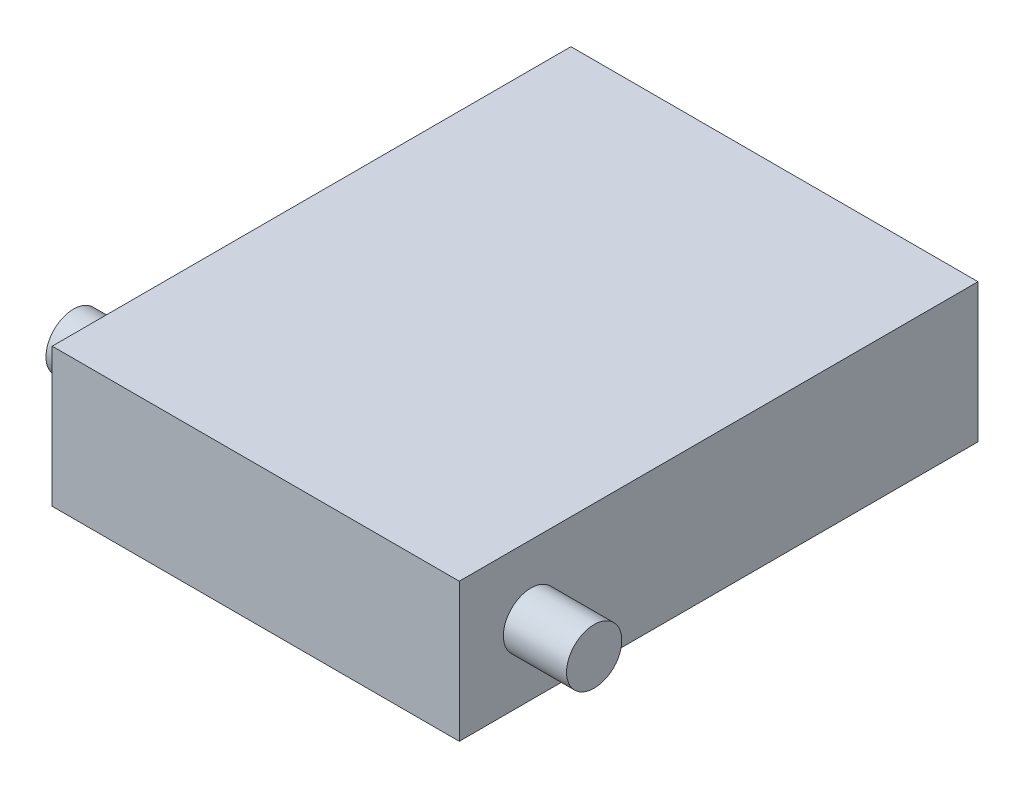
ISO-10303-21;
HEADER;
FILE_DESCRIPTION(('STEP AP214'),'2;1');
FILE_NAME('part.step','',(''),(''),'','','');
FILE_SCHEMA(('AUTOMOTIVE_DESIGN { 1 0 10303 214 1 1 1 1 }'));
ENDSEC;
DATA;
#1=APPLICATION_CONTEXT('core data for automotive mechanical design processes');
#2=APPLICATION_PROTOCOL_DEFINITION('international standard','automotive_design',2000,#1);
#3=PRODUCT_CONTEXT('',#1,'mechanical');
#4=PRODUCT('Part','Part','',(#3));
#5=PRODUCT_RELATED_PRODUCT_CATEGORY('part','',(#4));
#6=PRODUCT_DEFINITION_FORMATION('','',#4);
#7=PRODUCT_DEFINITION_CONTEXT('part definition',#1,'design');
#8=PRODUCT_DEFINITION('design','',#6,#7);
#9=PRODUCT_DEFINITION_SHAPE('','',#8);
#10=(LENGTH_UNIT() NAMED_UNIT(*) SI_UNIT(.MILLI.,.METRE.));
#11=(NAMED_UNIT(*) PLANE_ANGLE_UNIT() SI_UNIT($,.RADIAN.));
#12=(NAMED_UNIT(*) SI_UNIT($,.STERADIAN.) SOLID_ANGLE_UNIT());
#13=UNCERTAINTY_MEASURE_WITH_UNIT(LENGTH_MEASURE(1.E-05),#10,'distance_accuracy_value','');
#14=(GEOMETRIC_REPRESENTATION_CONTEXT(3) GLOBAL_UNCERTAINTY_ASSIGNED_CONTEXT((#13)) GLOBAL_UNIT_ASSIGNED_CONTEXT((#10,
#11,#12)) REPRESENTATION_CONTEXT('',''));
#15=CARTESIAN_POINT('',(0.,0.,0.));
#16=DIRECTION('',(0.,0.,1.));
#17=DIRECTION('',(1.,0.,0.));
#18=AXIS2_PLACEMENT_3D('',#15,#16,#17);
#19=CARTESIAN_POINT('',(0.,-6.93,0.));
#20=DIRECTION('',(-1.,0.,0.));
#21=DIRECTION('',(0.,0.,1.));
#22=AXIS2_PLACEMENT_3D('',#19,#20,#21);
#23=PLANE('',#22);
#24=CARTESIAN_POINT('',(0.,-3.465,21.6940915090541));
#25=DIRECTION('',(-1.,0.,0.));
#26=DIRECTION('',(0.,0.,1.));
#27=AXIS2_PLACEMENT_3D('',#24,#25,#26);
#28=CIRCLE('',#27,1.38);
#29=CARTESIAN_POINT('',(0.,-3.465,20.3140915090541));
#30=VERTEX_POINT('',#29);
#31=EDGE_CURVE('E152',#30,#30,#28,.T.);
#32=ORIENTED_EDGE('',*,*,#31,.F.);
#33=EDGE_LOOP('',(#32));
#34=FACE_BOUND('',#33,.T.);
#35=DIRECTION('',(0.,0.,1.));
#36=VECTOR('',#35,1.);
#37=CARTESIAN_POINT('',(0.,0.,0.));
#38=LINE('',#37,#36);
#39=CARTESIAN_POINT('',(0.,0.,0.));
#40=VERTEX_POINT('',#39);
#41=CARTESIAN_POINT('',(0.,0.,25.92));
#42=VERTEX_POINT('',#41);
#43=EDGE_CURVE('E114',#40,#42,#38,.T.);
#44=ORIENTED_EDGE('',*,*,#43,.F.);
#45=DIRECTION('',(0.,1.,0.));
#46=VECTOR('',#45,1.);
#47=CARTESIAN_POINT('',(0.,-6.93,0.));
#48=LINE('',#47,#46);
#49=CARTESIAN_POINT('',(0.,-6.93,0.));
#50=VERTEX_POINT('',#49);
#51=EDGE_CURVE('E49',#50,#40,#48,.T.);
#52=ORIENTED_EDGE('',*,*,#51,.F.);
#53=DIRECTION('',(0.,0.,1.));
#54=VECTOR('',#53,1.);
#55=CARTESIAN_POINT('',(0.,-6.93,0.));
#56=LINE('',#55,#54);
#57=CARTESIAN_POINT('',(0.,-6.93,25.92));
#58=VERTEX_POINT('',#57);
#59=EDGE_CURVE('E106',#50,#58,#56,.T.);
#60=ORIENTED_EDGE('',*,*,#59,.T.);
#61=DIRECTION('',(0.,1.,0.));
#62=VECTOR('',#61,1.);
#63=CARTESIAN_POINT('',(0.,-6.93,25.92));
#64=LINE('',#63,#62);
#65=EDGE_CURVE('E81',#58,#42,#64,.T.);
#66=ORIENTED_EDGE('',*,*,#65,.T.);
#67=EDGE_LOOP('',(#44,#52,#60,#66));
#68=FACE_BOUND('',#67,.T.);
#69=ADVANCED_FACE('F40',(#34,#68),#23,.T.);
#70=CARTESIAN_POINT('',(0.,-6.93,0.));
#71=DIRECTION('',(0.,0.,1.));
#72=DIRECTION('',(1.,0.,0.));
#73=AXIS2_PLACEMENT_3D('',#70,#71,#72);
#74=PLANE('',#73);
#75=DIRECTION('',(1.,0.,0.));
#76=VECTOR('',#75,1.);
#77=CARTESIAN_POINT('',(0.,0.,0.));
#78=LINE('',#77,#76);
#79=CARTESIAN_POINT('',(20.34,0.,0.));
#80=VERTEX_POINT('',#79);
#81=EDGE_CURVE('E73',#40,#80,#78,.T.);
#82=ORIENTED_EDGE('',*,*,#81,.T.);
#83=DIRECTION('',(0.,1.,0.));
#84=VECTOR('',#83,1.);
#85=CARTESIAN_POINT('',(20.34,-6.93,0.));
#86=LINE('',#85,#84);
#87=CARTESIAN_POINT('',(20.34,-6.93,0.));
#88=VERTEX_POINT('',#87);
#89=EDGE_CURVE('E102',#88,#80,#86,.T.);
#90=ORIENTED_EDGE('',*,*,#89,.F.);
#91=DIRECTION('',(1.,0.,0.));
#92=VECTOR('',#91,1.);
#93=CARTESIAN_POINT('',(0.,-6.93,0.));
#94=LINE('',#93,#92);
#95=EDGE_CURVE('E91',#50,#88,#94,.T.);
#96=ORIENTED_EDGE('',*,*,#95,.F.);
#97=ORIENTED_EDGE('',*,*,#51,.T.);
#98=EDGE_LOOP('',(#82,#90,#96,#97));
#99=FACE_BOUND('',#98,.T.);
#100=ADVANCED_FACE('F145',(#99),#74,.F.);
#101=CARTESIAN_POINT('',(20.34,-6.93,0.));
#102=DIRECTION('',(-1.,0.,0.));
#103=DIRECTION('',(0.,0.,1.));
#104=AXIS2_PLACEMENT_3D('',#101,#102,#103);
#105=PLANE('',#104);
#106=CARTESIAN_POINT('',(20.34,-3.465,22.3367336936668));
#107=DIRECTION('',(-1.,0.,0.));
#108=DIRECTION('',(0.,0.,1.));
#109=AXIS2_PLACEMENT_3D('',#106,#107,#108);
#110=CIRCLE('',#109,1.38);
#111=CARTESIAN_POINT('',(20.34,-3.465,23.7167336936668));
#112=VERTEX_POINT('',#111);
#113=EDGE_CURVE('E11',#112,#112,#110,.F.);
#114=ORIENTED_EDGE('',*,*,#113,.F.);
#115=EDGE_LOOP('',(#114));
#116=FACE_BOUND('',#115,.T.);
#117=DIRECTION('',(0.,0.,1.));
#118=VECTOR('',#117,1.);
#119=CARTESIAN_POINT('',(20.34,0.,0.));
#120=LINE('',#119,#118);
#121=CARTESIAN_POINT('',(20.34,0.,25.92));
#122=VERTEX_POINT('',#121);
#123=EDGE_CURVE('E99',#80,#122,#120,.T.);
#124=ORIENTED_EDGE('',*,*,#123,.T.);
#125=DIRECTION('',(0.,1.,0.));
#126=VECTOR('',#125,1.);
#127=CARTESIAN_POINT('',(20.34,-6.93,25.92));
#128=LINE('',#127,#126);
#129=CARTESIAN_POINT('',(20.34,-6.93,25.92));
#130=VERTEX_POINT('',#129);
#131=EDGE_CURVE('E96',#130,#122,#128,.T.);
#132=ORIENTED_EDGE('',*,*,#131,.F.);
#133=DIRECTION('',(0.,0.,1.));
#134=VECTOR('',#133,1.);
#135=CARTESIAN_POINT('',(20.34,-6.93,0.));
#136=LINE('',#135,#134);
#137=EDGE_CURVE('E86',#88,#130,#136,.T.);
#138=ORIENTED_EDGE('',*,*,#137,.F.);
#139=ORIENTED_EDGE('',*,*,#89,.T.);
#140=EDGE_LOOP('',(#124,#132,#138,#139));
#141=FACE_BOUND('',#140,.T.);
#142=ADVANCED_FACE('F97',(#116,#141),#105,.F.);
#143=CARTESIAN_POINT('',(0.,-6.93,25.92));
#144=DIRECTION('',(0.,0.,1.));
#145=DIRECTION('',(1.,0.,0.));
#146=AXIS2_PLACEMENT_3D('',#143,#144,#145);
#147=PLANE('',#146);
#148=DIRECTION('',(1.,0.,0.));
#149=VECTOR('',#148,1.);
#150=CARTESIAN_POINT('',(0.,0.,25.92));
#151=LINE('',#150,#149);
#152=EDGE_CURVE('E118',#42,#122,#151,.T.);
#153=ORIENTED_EDGE('',*,*,#152,.F.);
#154=ORIENTED_EDGE('',*,*,#65,.F.);
#155=DIRECTION('',(1.,0.,0.));
#156=VECTOR('',#155,1.);
#157=CARTESIAN_POINT('',(0.,-6.93,25.92));
#158=LINE('',#157,#156);
#159=EDGE_CURVE('E90',#58,#130,#158,.T.);
#160=ORIENTED_EDGE('',*,*,#159,.T.);
#161=ORIENTED_EDGE('',*,*,#131,.T.);
#162=EDGE_LOOP('',(#153,#154,#160,#161));
#163=FACE_BOUND('',#162,.T.);
#164=ADVANCED_FACE('F104',(#163),#147,.T.);
#165=CARTESIAN_POINT('',(0.,-6.93,0.));
#166=DIRECTION('',(0.,1.,0.));
#167=DIRECTION('',(0.,0.,1.));
#168=AXIS2_PLACEMENT_3D('',#165,#166,#167);
#169=PLANE('',#168);
#170=ORIENTED_EDGE('',*,*,#59,.F.);
#171=ORIENTED_EDGE('',*,*,#95,.T.);
#172=ORIENTED_EDGE('',*,*,#137,.T.);
#173=ORIENTED_EDGE('',*,*,#159,.F.);
#174=EDGE_LOOP('',(#170,#171,#172,#173));
#175=FACE_BOUND('',#174,.T.);
#176=ADVANCED_FACE('F89',(#175),#169,.F.);
#177=CARTESIAN_POINT('',(0.,0.,0.));
#178=DIRECTION('',(0.,1.,0.));
#179=DIRECTION('',(0.,0.,1.));
#180=AXIS2_PLACEMENT_3D('',#177,#178,#179);
#181=PLANE('',#180);
#182=ORIENTED_EDGE('',*,*,#43,.T.);
#183=ORIENTED_EDGE('',*,*,#152,.T.);
#184=ORIENTED_EDGE('',*,*,#123,.F.);
#185=ORIENTED_EDGE('',*,*,#81,.F.);
#186=EDGE_LOOP('',(#182,#183,#184,#185));
#187=FACE_BOUND('',#186,.T.);
#188=ADVANCED_FACE('F131',(#187),#181,.T.);
#189=CARTESIAN_POINT('',(23.498,-3.465,22.3367336936668));
#190=DIRECTION('',(-1.,0.,0.));
#191=DIRECTION('',(0.,0.,1.));
#192=AXIS2_PLACEMENT_3D('',#189,#190,#191);
#193=CYLINDRICAL_SURFACE('',#192,1.38);
#194=CARTESIAN_POINT('',(23.498,-3.465,22.3367336936668));
#195=DIRECTION('',(1.,0.,0.));
#196=DIRECTION('',(0.,0.,-1.));
#197=AXIS2_PLACEMENT_3D('',#194,#195,#196);
#198=CIRCLE('',#197,1.38);
#199=CARTESIAN_POINT('',(23.498,-3.465,23.7167336936668));
#200=VERTEX_POINT('',#199);
#201=EDGE_CURVE('E119',#200,#200,#198,.T.);
#202=CARTESIAN_POINT('',(23.498,-3.465,23.7167336936668));
#203=CARTESIAN_POINT('',(23.4651041666667,-3.465,23.7167336936668));
#204=CARTESIAN_POINT('',(23.4322083333333,-3.465,23.7167336936668));
#205=CARTESIAN_POINT('',(23.3664166666667,-3.465,23.7167336936668));
#206=CARTESIAN_POINT('',(23.3335208333333,-3.465,23.7167336936668));
#207=CARTESIAN_POINT('',(23.2677291666667,-3.465,23.7167336936668));
#208=CARTESIAN_POINT('',(23.2348333333333,-3.465,23.7167336936668));
#209=CARTESIAN_POINT('',(23.1690416666667,-3.465,23.7167336936668));
#210=CARTESIAN_POINT('',(23.1361458333333,-3.465,23.7167336936668));
#211=CARTESIAN_POINT('',(23.0703541666667,-3.465,23.7167336936668));
#212=CARTESIAN_POINT('',(23.0374583333333,-3.465,23.7167336936668));
#213=CARTESIAN_POINT('',(22.9716666666667,-3.465,23.7167336936668));
#214=CARTESIAN_POINT('',(22.9387708333333,-3.465,23.7167336936668));
#215=CARTESIAN_POINT('',(22.8729791666667,-3.465,23.7167336936668));
#216=CARTESIAN_POINT('',(22.8400833333333,-3.465,23.7167336936668));
#217=CARTESIAN_POINT('',(22.7742916666667,-3.465,23.7167336936668));
#218=CARTESIAN_POINT('',(22.7413958333333,-3.465,23.7167336936668));
#219=CARTESIAN_POINT('',(22.6756041666667,-3.465,23.7167336936668));
#220=CARTESIAN_POINT('',(22.6427083333333,-3.465,23.7167336936668));
#221=CARTESIAN_POINT('',(22.5769166666667,-3.465,23.7167336936668));
#222=CARTESIAN_POINT('',(22.5440208333333,-3.465,23.7167336936668));
#223=CARTESIAN_POINT('',(22.4782291666667,-3.465,23.7167336936668));
#224=CARTESIAN_POINT('',(22.4453333333333,-3.465,23.7167336936668));
#225=CARTESIAN_POINT('',(22.3795416666667,-3.465,23.7167336936668));
#226=CARTESIAN_POINT('',(22.3466458333333,-3.465,23.7167336936668));
#227=CARTESIAN_POINT('',(22.2808541666667,-3.465,23.7167336936668));
#228=CARTESIAN_POINT('',(22.2479583333333,-3.465,23.7167336936668));
#229=CARTESIAN_POINT('',(22.1821666666667,-3.465,23.7167336936668));
#230=CARTESIAN_POINT('',(22.1492708333333,-3.465,23.7167336936668));
#231=CARTESIAN_POINT('',(22.0834791666667,-3.465,23.7167336936668));
#232=CARTESIAN_POINT('',(22.0505833333333,-3.465,23.7167336936668));
#233=CARTESIAN_POINT('',(21.9847916666667,-3.465,23.7167336936668));
#234=CARTESIAN_POINT('',(21.9518958333333,-3.465,23.7167336936668));
#235=CARTESIAN_POINT('',(21.8861041666667,-3.465,23.7167336936668));
#236=CARTESIAN_POINT('',(21.8532083333333,-3.465,23.7167336936668));
#237=CARTESIAN_POINT('',(21.7874166666667,-3.465,23.7167336936668));
#238=CARTESIAN_POINT('',(21.7545208333333,-3.465,23.7167336936668));
#239=CARTESIAN_POINT('',(21.6887291666667,-3.465,23.7167336936668));
#240=CARTESIAN_POINT('',(21.6558333333333,-3.465,23.7167336936668));
#241=CARTESIAN_POINT('',(21.5900416666667,-3.465,23.7167336936668));
#242=CARTESIAN_POINT('',(21.5571458333333,-3.465,23.7167336936668));
#243=CARTESIAN_POINT('',(21.4913541666667,-3.465,23.7167336936668));
#244=CARTESIAN_POINT('',(21.4584583333333,-3.465,23.7167336936668));
#245=CARTESIAN_POINT('',(21.3926666666667,-3.465,23.7167336936668));
#246=CARTESIAN_POINT('',(21.3597708333333,-3.465,23.7167336936668));
#247=CARTESIAN_POINT('',(21.2939791666667,-3.465,23.7167336936668));
#248=CARTESIAN_POINT('',(21.2610833333333,-3.465,23.7167336936668));
#249=CARTESIAN_POINT('',(21.1952916666667,-3.465,23.7167336936668));
#250=CARTESIAN_POINT('',(21.1623958333333,-3.465,23.7167336936668));
#251=CARTESIAN_POINT('',(21.0966041666667,-3.465,23.7167336936668));
#252=CARTESIAN_POINT('',(21.0637083333333,-3.465,23.7167336936668));
#253=CARTESIAN_POINT('',(20.9979166666667,-3.465,23.7167336936668));
#254=CARTESIAN_POINT('',(20.9650208333333,-3.465,23.7167336936668));
#255=CARTESIAN_POINT('',(20.8992291666667,-3.465,23.7167336936668));
#256=CARTESIAN_POINT('',(20.8663333333333,-3.465,23.7167336936668));
#257=CARTESIAN_POINT('',(20.8005416666667,-3.465,23.7167336936668));
#258=CARTESIAN_POINT('',(20.7676458333333,-3.465,23.7167336936668));
#259=CARTESIAN_POINT('',(20.7018541666667,-3.465,23.7167336936668));
#260=CARTESIAN_POINT('',(20.6689583333333,-3.465,23.7167336936668));
#261=CARTESIAN_POINT('',(20.6031666666667,-3.465,23.7167336936668));
#262=CARTESIAN_POINT('',(20.5702708333333,-3.465,23.7167336936668));
#263=CARTESIAN_POINT('',(20.5044791666667,-3.465,23.7167336936668));
#264=CARTESIAN_POINT('',(20.4715833333333,-3.465,23.7167336936668));
#265=CARTESIAN_POINT('',(20.4057916666667,-3.465,23.7167336936668));
#266=CARTESIAN_POINT('',(20.3728958333333,-3.465,23.7167336936668));
#267=CARTESIAN_POINT('',(20.34,-3.465,23.7167336936668));
#268=B_SPLINE_CURVE_WITH_KNOTS('',3,(#202,#203,#204,#205,#206,#207,#208,#209,#210,#211,#212,
#213,#214,#215,#216,#217,#218,#219,#220,#221,#222,#223,#224,#225,#226,#227,#228,#229,#230,#231,
#232,#233,#234,#235,#236,#237,#238,#239,#240,#241,#242,#243,#244,#245,#246,#247,#248,#249,#250,
#251,#252,#253,#254,#255,#256,#257,#258,#259,#260,#261,#262,#263,#264,#265,#266,#267),
.UNSPECIFIED.,.F.,.F.,(4,2,2,2,2,2,2,2,2,2,2,2,2,2,2,2,2,2,2,2,2,2,2,2,2,2,2,2,2,2,2,2,4),(0.,
0.0986874999999998,0.197375,0.296062499999999,0.394749999999999,0.493437499999999,
0.592124999999999,0.690812499999999,0.789499999999999,0.888187499999998,0.986874999999998,
1.0855625,1.18425,1.2829375,1.381625,1.4803125,1.579,1.6776875,1.776375,1.8750625,1.97375,
2.0724375,2.171125,2.2698125,2.3685,2.4671875,2.565875,2.6645625,2.76324999999999,
2.86193749999999,2.96062499999999,3.05931249999999,3.15799999999999),.UNSPECIFIED.);
#269=EDGE_CURVE('BSEAM133',#200,#112,#268,.T.);
#270=ORIENTED_EDGE('',*,*,#201,.F.);
#271=ORIENTED_EDGE('',*,*,#113,.T.);
#272=ORIENTED_EDGE('',*,*,#269,.T.);
#273=ORIENTED_EDGE('',*,*,#269,.F.);
#274=EDGE_LOOP('',(#270,#272,#271,#273));
#275=FACE_BOUND('',#274,.T.);
#276=ADVANCED_FACE('F133',(#275),#193,.T.);
#277=CARTESIAN_POINT('',(23.498,-3.465,22.3367336936668));
#278=DIRECTION('',(1.,0.,0.));
#279=DIRECTION('',(0.,0.,-1.));
#280=AXIS2_PLACEMENT_3D('',#277,#278,#279);
#281=PLANE('',#280);
#282=ORIENTED_EDGE('',*,*,#201,.T.);
#283=EDGE_LOOP('',(#282));
#284=FACE_BOUND('',#283,.T.);
#285=ADVANCED_FACE('F139',(#284),#281,.T.);
#286=CARTESIAN_POINT('',(-3.158,-3.465,21.6940915090541));
#287=DIRECTION('',(1.,0.,0.));
#288=DIRECTION('',(0.,0.,-1.));
#289=AXIS2_PLACEMENT_3D('',#286,#287,#288);
#290=CYLINDRICAL_SURFACE('',#289,1.38);
#291=CARTESIAN_POINT('',(-3.158,-3.465,21.6940915090541));
#292=DIRECTION('',(-1.,0.,0.));
#293=DIRECTION('',(0.,0.,1.));
#294=AXIS2_PLACEMENT_3D('',#291,#292,#293);
#295=CIRCLE('',#294,1.38);
#296=CARTESIAN_POINT('',(-3.158,-3.465,20.3140915090541));
#297=VERTEX_POINT('',#296);
#298=EDGE_CURVE('E155',#297,#297,#295,.T.);
#299=CARTESIAN_POINT('',(-3.158,-3.465,20.3140915090541));
#300=CARTESIAN_POINT('',(-3.12510416666666,-3.465,20.3140915090541));
#301=CARTESIAN_POINT('',(-3.09220833333333,-3.465,20.3140915090541));
#302=CARTESIAN_POINT('',(-3.02641666666666,-3.465,20.3140915090541));
#303=CARTESIAN_POINT('',(-2.99352083333333,-3.465,20.3140915090541));
#304=CARTESIAN_POINT('',(-2.92772916666666,-3.465,20.3140915090541));
#305=CARTESIAN_POINT('',(-2.89483333333333,-3.465,20.3140915090541));
#306=CARTESIAN_POINT('',(-2.82904166666666,-3.465,20.3140915090541));
#307=CARTESIAN_POINT('',(-2.79614583333333,-3.465,20.3140915090541));
#308=CARTESIAN_POINT('',(-2.73035416666666,-3.465,20.3140915090541));
#309=CARTESIAN_POINT('',(-2.69745833333333,-3.465,20.3140915090541));
#310=CARTESIAN_POINT('',(-2.63166666666666,-3.465,20.3140915090541));
#311=CARTESIAN_POINT('',(-2.59877083333333,-3.465,20.3140915090541));
#312=CARTESIAN_POINT('',(-2.53297916666666,-3.465,20.3140915090541));
#313=CARTESIAN_POINT('',(-2.50008333333333,-3.465,20.3140915090541));
#314=CARTESIAN_POINT('',(-2.43429166666666,-3.465,20.3140915090541));
#315=CARTESIAN_POINT('',(-2.40139583333333,-3.465,20.3140915090541));
#316=CARTESIAN_POINT('',(-2.33560416666666,-3.465,20.3140915090541));
#317=CARTESIAN_POINT('',(-2.30270833333333,-3.465,20.3140915090541));
#318=CARTESIAN_POINT('',(-2.23691666666666,-3.465,20.3140915090541));
#319=CARTESIAN_POINT('',(-2.20402083333333,-3.465,20.3140915090541));
#320=CARTESIAN_POINT('',(-2.13822916666666,-3.465,20.3140915090541));
#321=CARTESIAN_POINT('',(-2.10533333333333,-3.465,20.3140915090541));
#322=CARTESIAN_POINT('',(-2.03954166666666,-3.465,20.3140915090541));
#323=CARTESIAN_POINT('',(-2.00664583333333,-3.465,20.3140915090541));
#324=CARTESIAN_POINT('',(-1.94085416666666,-3.465,20.3140915090541));
#325=CARTESIAN_POINT('',(-1.90795833333333,-3.465,20.3140915090541));
#326=CARTESIAN_POINT('',(-1.84216666666666,-3.465,20.3140915090541));
#327=CARTESIAN_POINT('',(-1.80927083333333,-3.465,20.3140915090541));
#328=CARTESIAN_POINT('',(-1.74347916666666,-3.465,20.3140915090541));
#329=CARTESIAN_POINT('',(-1.71058333333333,-3.465,20.3140915090541));
#330=CARTESIAN_POINT('',(-1.64479166666666,-3.465,20.3140915090541));
#331=CARTESIAN_POINT('',(-1.61189583333333,-3.465,20.3140915090541));
#332=CARTESIAN_POINT('',(-1.54610416666666,-3.465,20.3140915090541));
#333=CARTESIAN_POINT('',(-1.51320833333333,-3.465,20.3140915090541));
#334=CARTESIAN_POINT('',(-1.44741666666666,-3.465,20.3140915090541));
#335=CARTESIAN_POINT('',(-1.41452083333333,-3.465,20.3140915090541));
#336=CARTESIAN_POINT('',(-1.34872916666666,-3.465,20.3140915090541));
#337=CARTESIAN_POINT('',(-1.31583333333333,-3.465,20.3140915090541));
#338=CARTESIAN_POINT('',(-1.25004166666666,-3.465,20.3140915090541));
#339=CARTESIAN_POINT('',(-1.21714583333333,-3.465,20.3140915090541));
#340=CARTESIAN_POINT('',(-1.15135416666666,-3.465,20.3140915090541));
#341=CARTESIAN_POINT('',(-1.11845833333333,-3.465,20.3140915090541));
#342=CARTESIAN_POINT('',(-1.05266666666666,-3.465,20.3140915090541));
#343=CARTESIAN_POINT('',(-1.01977083333333,-3.465,20.3140915090541));
#344=CARTESIAN_POINT('',(-0.953979166666664,-3.465,20.3140915090541));
#345=CARTESIAN_POINT('',(-0.921083333333331,-3.465,20.3140915090541));
#346=CARTESIAN_POINT('',(-0.855291666666664,-3.465,20.3140915090541));
#347=CARTESIAN_POINT('',(-0.822395833333331,-3.465,20.3140915090541));
#348=CARTESIAN_POINT('',(-0.756604166666664,-3.465,20.3140915090541));
#349=CARTESIAN_POINT('',(-0.723708333333331,-3.465,20.3140915090541));
#350=CARTESIAN_POINT('',(-0.657916666666664,-3.465,20.3140915090541));
#351=CARTESIAN_POINT('',(-0.625020833333331,-3.465,20.3140915090541));
#352=CARTESIAN_POINT('',(-0.559229166666664,-3.465,20.3140915090541));
#353=CARTESIAN_POINT('',(-0.526333333333331,-3.465,20.3140915090541));
#354=CARTESIAN_POINT('',(-0.460541666666664,-3.465,20.3140915090541));
#355=CARTESIAN_POINT('',(-0.427645833333331,-3.465,20.3140915090541));
#356=CARTESIAN_POINT('',(-0.361854166666664,-3.465,20.3140915090541));
#357=CARTESIAN_POINT('',(-0.328958333333331,-3.465,20.3140915090541));
#358=CARTESIAN_POINT('',(-0.263166666666664,-3.465,20.3140915090541));
#359=CARTESIAN_POINT('',(-0.230270833333331,-3.465,20.3140915090541));
#360=CARTESIAN_POINT('',(-0.164479166666664,-3.465,20.3140915090541));
#361=CARTESIAN_POINT('',(-0.131583333333331,-3.465,20.3140915090541));
#362=CARTESIAN_POINT('',(-0.0657916666666639,-3.465,20.3140915090541));
#363=CARTESIAN_POINT('',(-0.0328958333333307,-3.465,20.3140915090541));
#364=CARTESIAN_POINT('',(0.,-3.465,20.3140915090541));
#365=B_SPLINE_CURVE_WITH_KNOTS('',3,(#299,#300,#301,#302,#303,#304,#305,#306,#307,#308,#309,
#310,#311,#312,#313,#314,#315,#316,#317,#318,#319,#320,#321,#322,#323,#324,#325,#326,#327,#328,
#329,#330,#331,#332,#333,#334,#335,#336,#337,#338,#339,#340,#341,#342,#343,#344,#345,#346,#347,
#348,#349,#350,#351,#352,#353,#354,#355,#356,#357,#358,#359,#360,#361,#362,#363,#364),
.UNSPECIFIED.,.F.,.F.,(4,2,2,2,2,2,2,2,2,2,2,2,2,2,2,2,2,2,2,2,2,2,2,2,2,2,2,2,2,2,2,2,4),(0.,
0.0986875000000002,0.197375,0.2960625,0.39475,0.4934375,0.592125,0.6908125,0.7895,0.8881875,
0.986875,1.0855625,1.18425,1.2829375,1.381625,1.4803125,1.579,1.6776875,1.776375,1.8750625,
1.97375,2.0724375,2.171125,2.2698125,2.3685,2.4671875,2.565875,2.6645625,2.76325,2.8619375,
2.960625,3.0593125,3.158),.UNSPECIFIED.);
#366=EDGE_CURVE('BSEAM202',#297,#30,#365,.T.);
#367=ORIENTED_EDGE('',*,*,#298,.F.);
#368=ORIENTED_EDGE('',*,*,#31,.T.);
#369=ORIENTED_EDGE('',*,*,#366,.T.);
#370=ORIENTED_EDGE('',*,*,#366,.F.);
#371=EDGE_LOOP('',(#367,#369,#368,#370));
#372=FACE_BOUND('',#371,.T.);
#373=ADVANCED_FACE('F202',(#372),#290,.T.);
#374=CARTESIAN_POINT('',(-3.158,-3.465,21.6940915090541));
#375=DIRECTION('',(-1.,0.,0.));
#376=DIRECTION('',(0.,0.,1.));
#377=AXIS2_PLACEMENT_3D('',#374,#375,#376);
#378=PLANE('',#377);
#379=ORIENTED_EDGE('',*,*,#298,.T.);
#380=EDGE_LOOP('',(#379));
#381=FACE_BOUND('',#380,.T.);
#382=ADVANCED_FACE('F216',(#381),#378,.T.);
#383=CLOSED_SHELL('',(#69,#100,#142,#164,#176,#188,#276,#285,#373,#382));
#384=MANIFOLD_SOLID_BREP('B2',#383);
#385=ADVANCED_BREP_SHAPE_REPRESENTATION('',(#18,#384),#14);
#386=SHAPE_DEFINITION_REPRESENTATION(#9,#385);
ENDSEC;
END-ISO-10303-21;
